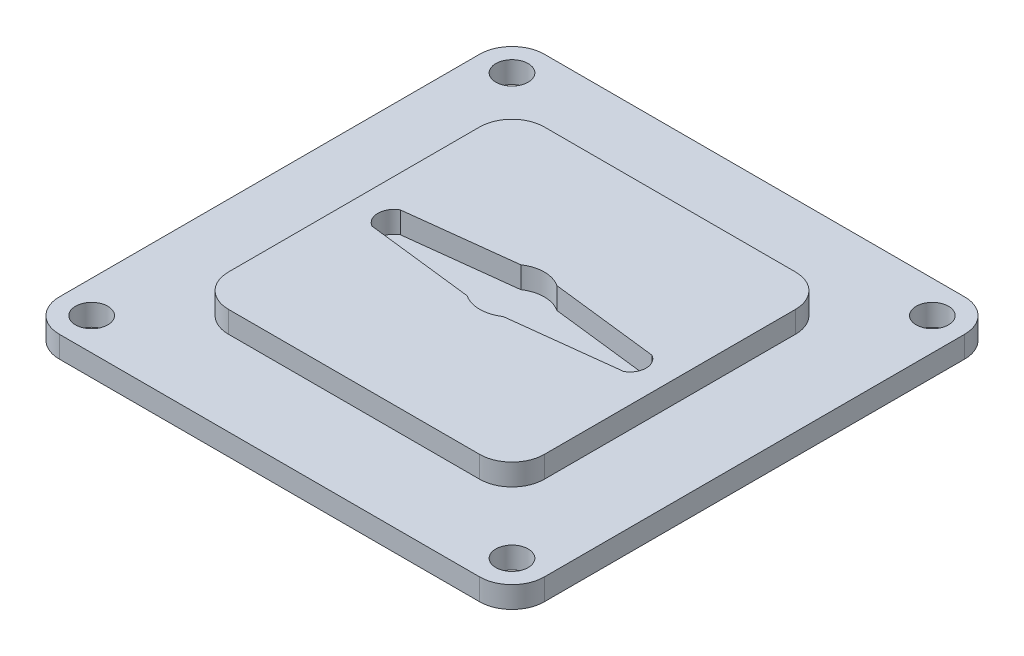
ISO-10303-21;
HEADER;
FILE_DESCRIPTION(('STEP AP214'),'2;1');
FILE_NAME('part.step','',(''),(''),'','','');
FILE_SCHEMA(('AUTOMOTIVE_DESIGN { 1 0 10303 214 1 1 1 1 }'));
ENDSEC;
DATA;
#1=APPLICATION_CONTEXT('core data for automotive mechanical design processes');
#2=APPLICATION_PROTOCOL_DEFINITION('international standard','automotive_design',2000,#1);
#3=PRODUCT_CONTEXT('',#1,'mechanical');
#4=PRODUCT('Part','Part','',(#3));
#5=PRODUCT_RELATED_PRODUCT_CATEGORY('part','',(#4));
#6=PRODUCT_DEFINITION_FORMATION('','',#4);
#7=PRODUCT_DEFINITION_CONTEXT('part definition',#1,'design');
#8=PRODUCT_DEFINITION('design','',#6,#7);
#9=PRODUCT_DEFINITION_SHAPE('','',#8);
#10=(LENGTH_UNIT() NAMED_UNIT(*) SI_UNIT(.MILLI.,.METRE.));
#11=(NAMED_UNIT(*) PLANE_ANGLE_UNIT() SI_UNIT($,.RADIAN.));
#12=(NAMED_UNIT(*) SI_UNIT($,.STERADIAN.) SOLID_ANGLE_UNIT());
#13=UNCERTAINTY_MEASURE_WITH_UNIT(LENGTH_MEASURE(1.E-05),#10,'distance_accuracy_value','');
#14=(GEOMETRIC_REPRESENTATION_CONTEXT(3) GLOBAL_UNCERTAINTY_ASSIGNED_CONTEXT((#13)) GLOBAL_UNIT_ASSIGNED_CONTEXT((#10,
#11,#12)) REPRESENTATION_CONTEXT('',''));
#15=CARTESIAN_POINT('',(0.,0.,0.));
#16=DIRECTION('',(0.,0.,1.));
#17=DIRECTION('',(1.,0.,0.));
#18=AXIS2_PLACEMENT_3D('',#15,#16,#17);
#19=CARTESIAN_POINT('',(-19.5,2.,19.5));
#20=DIRECTION('',(0.,1.,0.));
#21=DIRECTION('',(0.,0.,1.));
#22=AXIS2_PLACEMENT_3D('',#19,#20,#21);
#23=PLANE('',#22);
#24=CARTESIAN_POINT('',(-19.5,2.,-19.5));
#25=DIRECTION('',(0.,1.,0.));
#26=DIRECTION('',(0.,0.,1.));
#27=AXIS2_PLACEMENT_3D('',#24,#25,#26);
#28=CIRCLE('',#27,1.5);
#29=CARTESIAN_POINT('',(-19.5,2.,-18.));
#30=VERTEX_POINT('',#29);
#31=EDGE_CURVE('E331',#30,#30,#28,.T.);
#32=ORIENTED_EDGE('',*,*,#31,.F.);
#33=EDGE_LOOP('',(#32));
#34=FACE_BOUND('',#33,.T.);
#35=CARTESIAN_POINT('',(19.5,2.,19.5));
#36=DIRECTION('',(0.,1.,0.));
#37=DIRECTION('',(0.,0.,1.));
#38=AXIS2_PLACEMENT_3D('',#35,#36,#37);
#39=CIRCLE('',#38,1.5);
#40=CARTESIAN_POINT('',(19.5,2.,21.));
#41=VERTEX_POINT('',#40);
#42=EDGE_CURVE('E343',#41,#41,#39,.T.);
#43=ORIENTED_EDGE('',*,*,#42,.F.);
#44=EDGE_LOOP('',(#43));
#45=FACE_BOUND('',#44,.T.);
#46=CARTESIAN_POINT('',(-19.5,2.,19.5));
#47=DIRECTION('',(0.,1.,0.));
#48=DIRECTION('',(0.,0.,1.));
#49=AXIS2_PLACEMENT_3D('',#46,#47,#48);
#50=CIRCLE('',#49,3.);
#51=CARTESIAN_POINT('',(-22.5,2.,19.5));
#52=VERTEX_POINT('',#51);
#53=CARTESIAN_POINT('',(-19.5,2.,22.5));
#54=VERTEX_POINT('',#53);
#55=EDGE_CURVE('E349',#52,#54,#50,.T.);
#56=ORIENTED_EDGE('',*,*,#55,.T.);
#57=DIRECTION('',(1.,0.,0.));
#58=VECTOR('',#57,1.);
#59=CARTESIAN_POINT('',(-19.5,2.,22.5));
#60=LINE('',#59,#58);
#61=CARTESIAN_POINT('',(19.5,2.,22.5));
#62=VERTEX_POINT('',#61);
#63=EDGE_CURVE('E352',#54,#62,#60,.T.);
#64=ORIENTED_EDGE('',*,*,#63,.T.);
#65=CARTESIAN_POINT('',(19.5,2.,19.5));
#66=DIRECTION('',(0.,1.,0.));
#67=DIRECTION('',(0.,0.,1.));
#68=AXIS2_PLACEMENT_3D('',#65,#66,#67);
#69=CIRCLE('',#68,3.);
#70=CARTESIAN_POINT('',(22.5,2.,19.5));
#71=VERTEX_POINT('',#70);
#72=EDGE_CURVE('E355',#62,#71,#69,.T.);
#73=ORIENTED_EDGE('',*,*,#72,.T.);
#74=DIRECTION('',(0.,0.,-1.));
#75=VECTOR('',#74,1.);
#76=CARTESIAN_POINT('',(22.5,2.,-19.5));
#77=LINE('',#76,#75);
#78=CARTESIAN_POINT('',(22.5,2.,-19.5));
#79=VERTEX_POINT('',#78);
#80=EDGE_CURVE('E357',#71,#79,#77,.T.);
#81=ORIENTED_EDGE('',*,*,#80,.T.);
#82=CARTESIAN_POINT('',(19.5,2.,-19.5));
#83=DIRECTION('',(0.,1.,0.));
#84=DIRECTION('',(0.,0.,-1.));
#85=AXIS2_PLACEMENT_3D('',#82,#83,#84);
#86=CIRCLE('',#85,3.);
#87=CARTESIAN_POINT('',(19.5,2.,-22.5));
#88=VERTEX_POINT('',#87);
#89=EDGE_CURVE('E359',#79,#88,#86,.T.);
#90=ORIENTED_EDGE('',*,*,#89,.T.);
#91=DIRECTION('',(-1.,0.,0.));
#92=VECTOR('',#91,1.);
#93=CARTESIAN_POINT('',(-19.5,2.,-22.5));
#94=LINE('',#93,#92);
#95=CARTESIAN_POINT('',(-19.5,2.,-22.5));
#96=VERTEX_POINT('',#95);
#97=EDGE_CURVE('E361',#88,#96,#94,.T.);
#98=ORIENTED_EDGE('',*,*,#97,.T.);
#99=CARTESIAN_POINT('',(-19.5,2.,-19.5));
#100=DIRECTION('',(0.,1.,0.));
#101=DIRECTION('',(0.,0.,1.));
#102=AXIS2_PLACEMENT_3D('',#99,#100,#101);
#103=CIRCLE('',#102,3.);
#104=CARTESIAN_POINT('',(-22.5,2.,-19.5));
#105=VERTEX_POINT('',#104);
#106=EDGE_CURVE('E363',#96,#105,#103,.T.);
#107=ORIENTED_EDGE('',*,*,#106,.T.);
#108=DIRECTION('',(0.,0.,1.));
#109=VECTOR('',#108,1.);
#110=CARTESIAN_POINT('',(-22.5,2.,-19.5));
#111=LINE('',#110,#109);
#112=EDGE_CURVE('E365',#105,#52,#111,.T.);
#113=ORIENTED_EDGE('',*,*,#112,.T.);
#114=EDGE_LOOP('',(#56,#64,#73,#81,#90,#98,#107,#113));
#115=FACE_BOUND('',#114,.T.);
#116=CARTESIAN_POINT('',(19.5,2.,-19.5));
#117=DIRECTION('',(0.,1.,0.));
#118=DIRECTION('',(0.,0.,1.));
#119=AXIS2_PLACEMENT_3D('',#116,#117,#118);
#120=CIRCLE('',#119,1.5);
#121=CARTESIAN_POINT('',(19.5,2.,-18.));
#122=VERTEX_POINT('',#121);
#123=EDGE_CURVE('E337',#122,#122,#120,.T.);
#124=ORIENTED_EDGE('',*,*,#123,.F.);
#125=EDGE_LOOP('',(#124));
#126=FACE_BOUND('',#125,.T.);
#127=CARTESIAN_POINT('',(-19.5,2.,19.5));
#128=DIRECTION('',(0.,1.,0.));
#129=DIRECTION('',(0.,0.,1.));
#130=AXIS2_PLACEMENT_3D('',#127,#128,#129);
#131=CIRCLE('',#130,1.5);
#132=CARTESIAN_POINT('',(-19.5,2.,21.));
#133=VERTEX_POINT('',#132);
#134=EDGE_CURVE('E325',#133,#133,#131,.T.);
#135=ORIENTED_EDGE('',*,*,#134,.F.);
#136=EDGE_LOOP('',(#135));
#137=FACE_BOUND('',#136,.T.);
#138=DIRECTION('',(0.,0.,1.));
#139=VECTOR('',#138,1.);
#140=CARTESIAN_POINT('',(-14.653247837034,2.,-11.653247837034));
#141=LINE('',#140,#139);
#142=CARTESIAN_POINT('',(-14.653247837034,2.,-11.653247837034));
#143=VERTEX_POINT('',#142);
#144=CARTESIAN_POINT('',(-14.653247837034,2.,11.653247837034));
#145=VERTEX_POINT('',#144);
#146=EDGE_CURVE('E291',#143,#145,#141,.T.);
#147=ORIENTED_EDGE('',*,*,#146,.F.);
#148=CARTESIAN_POINT('',(-11.653247837034,2.,-11.653247837034));
#149=DIRECTION('',(0.,1.,0.));
#150=DIRECTION('',(0.,0.,1.));
#151=AXIS2_PLACEMENT_3D('',#148,#149,#150);
#152=CIRCLE('',#151,3.);
#153=CARTESIAN_POINT('',(-11.653247837034,2.,-14.653247837034));
#154=VERTEX_POINT('',#153);
#155=EDGE_CURVE('E258',#154,#143,#152,.T.);
#156=ORIENTED_EDGE('',*,*,#155,.F.);
#157=DIRECTION('',(-1.,0.,0.));
#158=VECTOR('',#157,1.);
#159=CARTESIAN_POINT('',(-11.653247837034,2.,-14.653247837034));
#160=LINE('',#159,#158);
#161=CARTESIAN_POINT('',(11.6532478370339,2.,-14.653247837034));
#162=VERTEX_POINT('',#161);
#163=EDGE_CURVE('E274',#162,#154,#160,.T.);
#164=ORIENTED_EDGE('',*,*,#163,.F.);
#165=CARTESIAN_POINT('',(11.653247837034,2.,-11.653247837034));
#166=DIRECTION('',(0.,1.,0.));
#167=DIRECTION('',(0.,0.,-1.));
#168=AXIS2_PLACEMENT_3D('',#165,#166,#167);
#169=CIRCLE('',#168,3.);
#170=CARTESIAN_POINT('',(14.653247837034,2.,-11.653247837034));
#171=VERTEX_POINT('',#170);
#172=EDGE_CURVE('E301',#171,#162,#169,.T.);
#173=ORIENTED_EDGE('',*,*,#172,.F.);
#174=DIRECTION('',(0.,0.,-1.));
#175=VECTOR('',#174,1.);
#176=CARTESIAN_POINT('',(14.653247837034,2.,-11.653247837034));
#177=LINE('',#176,#175);
#178=CARTESIAN_POINT('',(14.653247837034,2.,11.653247837034));
#179=VERTEX_POINT('',#178);
#180=EDGE_CURVE('E299',#179,#171,#177,.T.);
#181=ORIENTED_EDGE('',*,*,#180,.F.);
#182=CARTESIAN_POINT('',(11.653247837034,2.,11.653247837034));
#183=DIRECTION('',(0.,1.,0.));
#184=DIRECTION('',(0.,0.,1.));
#185=AXIS2_PLACEMENT_3D('',#182,#183,#184);
#186=CIRCLE('',#185,3.);
#187=CARTESIAN_POINT('',(11.653247837034,2.,14.653247837034));
#188=VERTEX_POINT('',#187);
#189=EDGE_CURVE('E297',#188,#179,#186,.T.);
#190=ORIENTED_EDGE('',*,*,#189,.F.);
#191=DIRECTION('',(1.,0.,0.));
#192=VECTOR('',#191,1.);
#193=CARTESIAN_POINT('',(-11.653247837034,2.,14.653247837034));
#194=LINE('',#193,#192);
#195=CARTESIAN_POINT('',(-11.653247837034,2.,14.653247837034));
#196=VERTEX_POINT('',#195);
#197=EDGE_CURVE('E295',#196,#188,#194,.T.);
#198=ORIENTED_EDGE('',*,*,#197,.F.);
#199=CARTESIAN_POINT('',(-11.653247837034,2.,11.653247837034));
#200=DIRECTION('',(0.,1.,0.));
#201=DIRECTION('',(0.,0.,1.));
#202=AXIS2_PLACEMENT_3D('',#199,#200,#201);
#203=CIRCLE('',#202,3.);
#204=EDGE_CURVE('E293',#145,#196,#203,.T.);
#205=ORIENTED_EDGE('',*,*,#204,.F.);
#206=EDGE_LOOP('',(#147,#156,#164,#173,#181,#190,#198,#205));
#207=FACE_BOUND('',#206,.T.);
#208=ADVANCED_FACE('F37',(#34,#45,#115,#126,#137,#207),#23,.T.);
#209=CARTESIAN_POINT('',(-19.5,0.,19.5));
#210=DIRECTION('',(0.,1.,0.));
#211=DIRECTION('',(0.,0.,1.));
#212=AXIS2_PLACEMENT_3D('',#209,#210,#211);
#213=PLANE('',#212);
#214=CARTESIAN_POINT('',(-19.5,0.,19.5));
#215=DIRECTION('',(0.,1.,0.));
#216=DIRECTION('',(0.,0.,1.));
#217=AXIS2_PLACEMENT_3D('',#214,#215,#216);
#218=CIRCLE('',#217,3.);
#219=CARTESIAN_POINT('',(-22.5,0.,19.5));
#220=VERTEX_POINT('',#219);
#221=CARTESIAN_POINT('',(-19.5,0.,22.5));
#222=VERTEX_POINT('',#221);
#223=EDGE_CURVE('E346',#220,#222,#218,.T.);
#224=ORIENTED_EDGE('',*,*,#223,.F.);
#225=DIRECTION('',(0.,0.,1.));
#226=VECTOR('',#225,1.);
#227=CARTESIAN_POINT('',(-22.5,0.,-19.5));
#228=LINE('',#227,#226);
#229=CARTESIAN_POINT('',(-22.5,0.,-19.5));
#230=VERTEX_POINT('',#229);
#231=EDGE_CURVE('E353',#230,#220,#228,.T.);
#232=ORIENTED_EDGE('',*,*,#231,.F.);
#233=CARTESIAN_POINT('',(-19.5,0.,-19.5));
#234=DIRECTION('',(0.,1.,0.));
#235=DIRECTION('',(0.,0.,1.));
#236=AXIS2_PLACEMENT_3D('',#233,#234,#235);
#237=CIRCLE('',#236,3.);
#238=CARTESIAN_POINT('',(-19.5,0.,-22.5));
#239=VERTEX_POINT('',#238);
#240=EDGE_CURVE('E380',#239,#230,#237,.T.);
#241=ORIENTED_EDGE('',*,*,#240,.F.);
#242=DIRECTION('',(-1.,0.,0.));
#243=VECTOR('',#242,1.);
#244=CARTESIAN_POINT('',(-19.5,0.,-22.5));
#245=LINE('',#244,#243);
#246=CARTESIAN_POINT('',(19.5,0.,-22.5));
#247=VERTEX_POINT('',#246);
#248=EDGE_CURVE('E378',#247,#239,#245,.T.);
#249=ORIENTED_EDGE('',*,*,#248,.F.);
#250=CARTESIAN_POINT('',(19.5,0.,-19.5));
#251=DIRECTION('',(0.,1.,0.));
#252=DIRECTION('',(0.,0.,-1.));
#253=AXIS2_PLACEMENT_3D('',#250,#251,#252);
#254=CIRCLE('',#253,3.);
#255=CARTESIAN_POINT('',(22.5,0.,-19.5));
#256=VERTEX_POINT('',#255);
#257=EDGE_CURVE('E376',#256,#247,#254,.T.);
#258=ORIENTED_EDGE('',*,*,#257,.F.);
#259=DIRECTION('',(0.,0.,-1.));
#260=VECTOR('',#259,1.);
#261=CARTESIAN_POINT('',(22.5,0.,-19.5));
#262=LINE('',#261,#260);
#263=CARTESIAN_POINT('',(22.5,0.,19.5));
#264=VERTEX_POINT('',#263);
#265=EDGE_CURVE('E374',#264,#256,#262,.T.);
#266=ORIENTED_EDGE('',*,*,#265,.F.);
#267=CARTESIAN_POINT('',(19.5,0.,19.5));
#268=DIRECTION('',(0.,1.,0.));
#269=DIRECTION('',(0.,0.,1.));
#270=AXIS2_PLACEMENT_3D('',#267,#268,#269);
#271=CIRCLE('',#270,3.);
#272=CARTESIAN_POINT('',(19.5,0.,22.5));
#273=VERTEX_POINT('',#272);
#274=EDGE_CURVE('E372',#273,#264,#271,.T.);
#275=ORIENTED_EDGE('',*,*,#274,.F.);
#276=DIRECTION('',(1.,0.,0.));
#277=VECTOR('',#276,1.);
#278=CARTESIAN_POINT('',(-19.5,0.,22.5));
#279=LINE('',#278,#277);
#280=EDGE_CURVE('E370',#222,#273,#279,.T.);
#281=ORIENTED_EDGE('',*,*,#280,.F.);
#282=EDGE_LOOP('',(#224,#232,#241,#249,#258,#266,#275,#281));
#283=FACE_BOUND('',#282,.T.);
#284=CARTESIAN_POINT('',(19.5,0.,19.5));
#285=DIRECTION('',(0.,1.,0.));
#286=DIRECTION('',(0.,0.,1.));
#287=AXIS2_PLACEMENT_3D('',#284,#285,#286);
#288=CIRCLE('',#287,1.5);
#289=CARTESIAN_POINT('',(19.5,0.,21.));
#290=VERTEX_POINT('',#289);
#291=EDGE_CURVE('E340',#290,#290,#288,.T.);
#292=ORIENTED_EDGE('',*,*,#291,.T.);
#293=EDGE_LOOP('',(#292));
#294=FACE_BOUND('',#293,.T.);
#295=CARTESIAN_POINT('',(19.5,0.,-19.5));
#296=DIRECTION('',(0.,1.,0.));
#297=DIRECTION('',(0.,0.,1.));
#298=AXIS2_PLACEMENT_3D('',#295,#296,#297);
#299=CIRCLE('',#298,1.5);
#300=CARTESIAN_POINT('',(19.5,0.,-18.));
#301=VERTEX_POINT('',#300);
#302=EDGE_CURVE('E334',#301,#301,#299,.T.);
#303=ORIENTED_EDGE('',*,*,#302,.T.);
#304=EDGE_LOOP('',(#303));
#305=FACE_BOUND('',#304,.T.);
#306=CARTESIAN_POINT('',(-19.5,0.,-19.5));
#307=DIRECTION('',(0.,1.,0.));
#308=DIRECTION('',(0.,0.,1.));
#309=AXIS2_PLACEMENT_3D('',#306,#307,#308);
#310=CIRCLE('',#309,1.5);
#311=CARTESIAN_POINT('',(-19.5,0.,-18.));
#312=VERTEX_POINT('',#311);
#313=EDGE_CURVE('E328',#312,#312,#310,.T.);
#314=ORIENTED_EDGE('',*,*,#313,.T.);
#315=EDGE_LOOP('',(#314));
#316=FACE_BOUND('',#315,.T.);
#317=CARTESIAN_POINT('',(-19.5,0.,19.5));
#318=DIRECTION('',(0.,1.,0.));
#319=DIRECTION('',(0.,0.,1.));
#320=AXIS2_PLACEMENT_3D('',#317,#318,#319);
#321=CIRCLE('',#320,1.5);
#322=CARTESIAN_POINT('',(-19.5,0.,21.));
#323=VERTEX_POINT('',#322);
#324=EDGE_CURVE('E324',#323,#323,#321,.T.);
#325=ORIENTED_EDGE('',*,*,#324,.T.);
#326=EDGE_LOOP('',(#325));
#327=FACE_BOUND('',#326,.T.);
#328=ADVANCED_FACE('F410',(#283,#294,#305,#316,#327),#213,.F.);
#329=CARTESIAN_POINT('',(-19.5,2.,19.5));
#330=DIRECTION('',(0.,-1.,0.));
#331=DIRECTION('',(0.,0.,-1.));
#332=AXIS2_PLACEMENT_3D('',#329,#330,#331);
#333=CYLINDRICAL_SURFACE('',#332,3.);
#334=ORIENTED_EDGE('',*,*,#223,.T.);
#335=DIRECTION('',(0.,-1.,0.));
#336=VECTOR('',#335,1.);
#337=CARTESIAN_POINT('',(-19.5,2.,22.5));
#338=LINE('',#337,#336);
#339=EDGE_CURVE('E11',#54,#222,#338,.T.);
#340=ORIENTED_EDGE('',*,*,#339,.F.);
#341=ORIENTED_EDGE('',*,*,#55,.F.);
#342=DIRECTION('',(0.,-1.,0.));
#343=VECTOR('',#342,1.);
#344=CARTESIAN_POINT('',(-22.5,2.,19.5));
#345=LINE('',#344,#343);
#346=EDGE_CURVE('E367',#52,#220,#345,.T.);
#347=ORIENTED_EDGE('',*,*,#346,.T.);
#348=EDGE_LOOP('',(#334,#340,#341,#347));
#349=FACE_BOUND('',#348,.T.);
#350=ADVANCED_FACE('F39',(#349),#333,.T.);
#351=CARTESIAN_POINT('',(-19.5,2.,22.5));
#352=DIRECTION('',(0.,0.,-1.));
#353=DIRECTION('',(-1.,0.,0.));
#354=AXIS2_PLACEMENT_3D('',#351,#352,#353);
#355=PLANE('',#354);
#356=ORIENTED_EDGE('',*,*,#280,.T.);
#357=DIRECTION('',(0.,-1.,0.));
#358=VECTOR('',#357,1.);
#359=CARTESIAN_POINT('',(19.5,2.,22.5));
#360=LINE('',#359,#358);
#361=EDGE_CURVE('E45',#62,#273,#360,.T.);
#362=ORIENTED_EDGE('',*,*,#361,.F.);
#363=ORIENTED_EDGE('',*,*,#63,.F.);
#364=ORIENTED_EDGE('',*,*,#339,.T.);
#365=EDGE_LOOP('',(#356,#362,#363,#364));
#366=FACE_BOUND('',#365,.T.);
#367=ADVANCED_FACE('F428',(#366),#355,.F.);
#368=CARTESIAN_POINT('',(19.5,2.,19.5));
#369=DIRECTION('',(0.,-1.,0.));
#370=DIRECTION('',(0.,0.,-1.));
#371=AXIS2_PLACEMENT_3D('',#368,#369,#370);
#372=CYLINDRICAL_SURFACE('',#371,3.);
#373=ORIENTED_EDGE('',*,*,#274,.T.);
#374=DIRECTION('',(0.,-1.,0.));
#375=VECTOR('',#374,1.);
#376=CARTESIAN_POINT('',(22.5,2.,19.5));
#377=LINE('',#376,#375);
#378=EDGE_CURVE('E397',#71,#264,#377,.T.);
#379=ORIENTED_EDGE('',*,*,#378,.F.);
#380=ORIENTED_EDGE('',*,*,#72,.F.);
#381=ORIENTED_EDGE('',*,*,#361,.T.);
#382=EDGE_LOOP('',(#373,#379,#380,#381));
#383=FACE_BOUND('',#382,.T.);
#384=ADVANCED_FACE('F404',(#383),#372,.T.);
#385=CARTESIAN_POINT('',(22.5,2.,-19.5));
#386=DIRECTION('',(-1.,0.,0.));
#387=DIRECTION('',(0.,0.,1.));
#388=AXIS2_PLACEMENT_3D('',#385,#386,#387);
#389=PLANE('',#388);
#390=ORIENTED_EDGE('',*,*,#265,.T.);
#391=DIRECTION('',(0.,-1.,0.));
#392=VECTOR('',#391,1.);
#393=CARTESIAN_POINT('',(22.5,2.,-19.5));
#394=LINE('',#393,#392);
#395=EDGE_CURVE('E394',#79,#256,#394,.T.);
#396=ORIENTED_EDGE('',*,*,#395,.F.);
#397=ORIENTED_EDGE('',*,*,#80,.F.);
#398=ORIENTED_EDGE('',*,*,#378,.T.);
#399=EDGE_LOOP('',(#390,#396,#397,#398));
#400=FACE_BOUND('',#399,.T.);
#401=ADVANCED_FACE('F416',(#400),#389,.F.);
#402=CARTESIAN_POINT('',(19.5,2.,-19.5));
#403=DIRECTION('',(0.,-1.,0.));
#404=DIRECTION('',(0.,0.,-1.));
#405=AXIS2_PLACEMENT_3D('',#402,#403,#404);
#406=CYLINDRICAL_SURFACE('',#405,3.);
#407=ORIENTED_EDGE('',*,*,#257,.T.);
#408=DIRECTION('',(0.,-1.,0.));
#409=VECTOR('',#408,1.);
#410=CARTESIAN_POINT('',(19.5,2.,-22.5));
#411=LINE('',#410,#409);
#412=EDGE_CURVE('E391',#88,#247,#411,.T.);
#413=ORIENTED_EDGE('',*,*,#412,.F.);
#414=ORIENTED_EDGE('',*,*,#89,.F.);
#415=ORIENTED_EDGE('',*,*,#395,.T.);
#416=EDGE_LOOP('',(#407,#413,#414,#415));
#417=FACE_BOUND('',#416,.T.);
#418=ADVANCED_FACE('F420',(#417),#406,.T.);
#419=CARTESIAN_POINT('',(-19.5,2.,-22.5));
#420=DIRECTION('',(0.,0.,1.));
#421=DIRECTION('',(1.,0.,0.));
#422=AXIS2_PLACEMENT_3D('',#419,#420,#421);
#423=PLANE('',#422);
#424=ORIENTED_EDGE('',*,*,#248,.T.);
#425=DIRECTION('',(0.,-1.,0.));
#426=VECTOR('',#425,1.);
#427=CARTESIAN_POINT('',(-19.5,2.,-22.5));
#428=LINE('',#427,#426);
#429=EDGE_CURVE('E388',#96,#239,#428,.T.);
#430=ORIENTED_EDGE('',*,*,#429,.F.);
#431=ORIENTED_EDGE('',*,*,#97,.F.);
#432=ORIENTED_EDGE('',*,*,#412,.T.);
#433=EDGE_LOOP('',(#424,#430,#431,#432));
#434=FACE_BOUND('',#433,.T.);
#435=ADVANCED_FACE('F441',(#434),#423,.F.);
#436=CARTESIAN_POINT('',(-19.5,2.,-19.5));
#437=DIRECTION('',(0.,-1.,0.));
#438=DIRECTION('',(0.,0.,-1.));
#439=AXIS2_PLACEMENT_3D('',#436,#437,#438);
#440=CYLINDRICAL_SURFACE('',#439,3.);
#441=ORIENTED_EDGE('',*,*,#240,.T.);
#442=DIRECTION('',(0.,-1.,0.));
#443=VECTOR('',#442,1.);
#444=CARTESIAN_POINT('',(-22.5,2.,-19.5));
#445=LINE('',#444,#443);
#446=EDGE_CURVE('E385',#105,#230,#445,.T.);
#447=ORIENTED_EDGE('',*,*,#446,.F.);
#448=ORIENTED_EDGE('',*,*,#106,.F.);
#449=ORIENTED_EDGE('',*,*,#429,.T.);
#450=EDGE_LOOP('',(#441,#447,#448,#449));
#451=FACE_BOUND('',#450,.T.);
#452=ADVANCED_FACE('F439',(#451),#440,.T.);
#453=CARTESIAN_POINT('',(-22.5,2.,-19.5));
#454=DIRECTION('',(1.,0.,0.));
#455=DIRECTION('',(0.,0.,-1.));
#456=AXIS2_PLACEMENT_3D('',#453,#454,#455);
#457=PLANE('',#456);
#458=ORIENTED_EDGE('',*,*,#231,.T.);
#459=ORIENTED_EDGE('',*,*,#346,.F.);
#460=ORIENTED_EDGE('',*,*,#112,.F.);
#461=ORIENTED_EDGE('',*,*,#446,.T.);
#462=EDGE_LOOP('',(#458,#459,#460,#461));
#463=FACE_BOUND('',#462,.T.);
#464=ADVANCED_FACE('F434',(#463),#457,.F.);
#465=CARTESIAN_POINT('',(19.5,2.,19.5));
#466=DIRECTION('',(0.,-1.,0.));
#467=DIRECTION('',(0.,0.,-1.));
#468=AXIS2_PLACEMENT_3D('',#465,#466,#467);
#469=CYLINDRICAL_SURFACE('',#468,1.5);
#470=ORIENTED_EDGE('',*,*,#42,.T.);
#471=EDGE_LOOP('',(#470));
#472=FACE_BOUND('',#471,.T.);
#473=ORIENTED_EDGE('',*,*,#291,.F.);
#474=EDGE_LOOP('',(#473));
#475=FACE_BOUND('',#474,.T.);
#476=ADVANCED_FACE('F460',(#472,#475),#469,.F.);
#477=CARTESIAN_POINT('',(19.5,2.,-19.5));
#478=DIRECTION('',(0.,-1.,0.));
#479=DIRECTION('',(0.,0.,-1.));
#480=AXIS2_PLACEMENT_3D('',#477,#478,#479);
#481=CYLINDRICAL_SURFACE('',#480,1.5);
#482=ORIENTED_EDGE('',*,*,#123,.T.);
#483=EDGE_LOOP('',(#482));
#484=FACE_BOUND('',#483,.T.);
#485=ORIENTED_EDGE('',*,*,#302,.F.);
#486=EDGE_LOOP('',(#485));
#487=FACE_BOUND('',#486,.T.);
#488=ADVANCED_FACE('F467',(#484,#487),#481,.F.);
#489=CARTESIAN_POINT('',(-19.5,2.,-19.5));
#490=DIRECTION('',(0.,-1.,0.));
#491=DIRECTION('',(0.,0.,-1.));
#492=AXIS2_PLACEMENT_3D('',#489,#490,#491);
#493=CYLINDRICAL_SURFACE('',#492,1.5);
#494=ORIENTED_EDGE('',*,*,#31,.T.);
#495=EDGE_LOOP('',(#494));
#496=FACE_BOUND('',#495,.T.);
#497=ORIENTED_EDGE('',*,*,#313,.F.);
#498=EDGE_LOOP('',(#497));
#499=FACE_BOUND('',#498,.T.);
#500=ADVANCED_FACE('F472',(#496,#499),#493,.F.);
#501=CARTESIAN_POINT('',(-19.5,2.,19.5));
#502=DIRECTION('',(0.,-1.,0.));
#503=DIRECTION('',(0.,0.,-1.));
#504=AXIS2_PLACEMENT_3D('',#501,#502,#503);
#505=CYLINDRICAL_SURFACE('',#504,1.5);
#506=ORIENTED_EDGE('',*,*,#134,.T.);
#507=EDGE_LOOP('',(#506));
#508=FACE_BOUND('',#507,.T.);
#509=ORIENTED_EDGE('',*,*,#324,.F.);
#510=EDGE_LOOP('',(#509));
#511=FACE_BOUND('',#510,.T.);
#512=ADVANCED_FACE('F484',(#508,#511),#505,.F.);
#513=CARTESIAN_POINT('',(-11.653247837034,4.,-11.653247837034));
#514=DIRECTION('',(0.,-1.,0.));
#515=DIRECTION('',(0.,0.,-1.));
#516=AXIS2_PLACEMENT_3D('',#513,#514,#515);
#517=CYLINDRICAL_SURFACE('',#516,3.);
#518=ORIENTED_EDGE('',*,*,#155,.T.);
#519=DIRECTION('',(0.,-1.,0.));
#520=VECTOR('',#519,1.);
#521=CARTESIAN_POINT('',(-14.653247837034,4.,-11.653247837034));
#522=LINE('',#521,#520);
#523=CARTESIAN_POINT('',(-14.653247837034,4.,-11.653247837034));
#524=VERTEX_POINT('',#523);
#525=EDGE_CURVE('E322',#524,#143,#522,.T.);
#526=ORIENTED_EDGE('',*,*,#525,.F.);
#527=CARTESIAN_POINT('',(-11.653247837034,4.,-11.653247837034));
#528=DIRECTION('',(0.,1.,0.));
#529=DIRECTION('',(0.,0.,1.));
#530=AXIS2_PLACEMENT_3D('',#527,#528,#529);
#531=CIRCLE('',#530,3.);
#532=CARTESIAN_POINT('',(-11.653247837034,4.,-14.653247837034));
#533=VERTEX_POINT('',#532);
#534=EDGE_CURVE('E270',#533,#524,#531,.T.);
#535=ORIENTED_EDGE('',*,*,#534,.F.);
#536=DIRECTION('',(0.,-1.,0.));
#537=VECTOR('',#536,1.);
#538=CARTESIAN_POINT('',(-11.653247837034,4.,-14.653247837034));
#539=LINE('',#538,#537);
#540=EDGE_CURVE('E288',#533,#154,#539,.T.);
#541=ORIENTED_EDGE('',*,*,#540,.T.);
#542=EDGE_LOOP('',(#518,#526,#535,#541));
#543=FACE_BOUND('',#542,.T.);
#544=ADVANCED_FACE('F486',(#543),#517,.T.);
#545=CARTESIAN_POINT('',(-14.653247837034,4.,-11.653247837034));
#546=DIRECTION('',(1.,0.,0.));
#547=DIRECTION('',(0.,0.,-1.));
#548=AXIS2_PLACEMENT_3D('',#545,#546,#547);
#549=PLANE('',#548);
#550=ORIENTED_EDGE('',*,*,#146,.T.);
#551=DIRECTION('',(0.,-1.,0.));
#552=VECTOR('',#551,1.);
#553=CARTESIAN_POINT('',(-14.653247837034,4.,11.653247837034));
#554=LINE('',#553,#552);
#555=CARTESIAN_POINT('',(-14.653247837034,4.,11.653247837034));
#556=VERTEX_POINT('',#555);
#557=EDGE_CURVE('E319',#556,#145,#554,.T.);
#558=ORIENTED_EDGE('',*,*,#557,.F.);
#559=DIRECTION('',(0.,0.,1.));
#560=VECTOR('',#559,1.);
#561=CARTESIAN_POINT('',(-14.653247837034,4.,-11.653247837034));
#562=LINE('',#561,#560);
#563=EDGE_CURVE('E273',#524,#556,#562,.T.);
#564=ORIENTED_EDGE('',*,*,#563,.F.);
#565=ORIENTED_EDGE('',*,*,#525,.T.);
#566=EDGE_LOOP('',(#550,#558,#564,#565));
#567=FACE_BOUND('',#566,.T.);
#568=ADVANCED_FACE('F493',(#567),#549,.F.);
#569=CARTESIAN_POINT('',(-11.653247837034,4.,11.653247837034));
#570=DIRECTION('',(0.,-1.,0.));
#571=DIRECTION('',(0.,0.,-1.));
#572=AXIS2_PLACEMENT_3D('',#569,#570,#571);
#573=CYLINDRICAL_SURFACE('',#572,3.);
#574=ORIENTED_EDGE('',*,*,#204,.T.);
#575=DIRECTION('',(0.,-1.,0.));
#576=VECTOR('',#575,1.);
#577=CARTESIAN_POINT('',(-11.653247837034,4.,14.653247837034));
#578=LINE('',#577,#576);
#579=CARTESIAN_POINT('',(-11.653247837034,4.,14.653247837034));
#580=VERTEX_POINT('',#579);
#581=EDGE_CURVE('E316',#580,#196,#578,.T.);
#582=ORIENTED_EDGE('',*,*,#581,.F.);
#583=CARTESIAN_POINT('',(-11.653247837034,4.,11.653247837034));
#584=DIRECTION('',(0.,1.,0.));
#585=DIRECTION('',(0.,0.,1.));
#586=AXIS2_PLACEMENT_3D('',#583,#584,#585);
#587=CIRCLE('',#586,3.);
#588=EDGE_CURVE('E276',#556,#580,#587,.T.);
#589=ORIENTED_EDGE('',*,*,#588,.F.);
#590=ORIENTED_EDGE('',*,*,#557,.T.);
#591=EDGE_LOOP('',(#574,#582,#589,#590));
#592=FACE_BOUND('',#591,.T.);
#593=ADVANCED_FACE('F501',(#592),#573,.T.);
#594=CARTESIAN_POINT('',(-11.653247837034,4.,14.653247837034));
#595=DIRECTION('',(0.,0.,-1.));
#596=DIRECTION('',(-1.,0.,0.));
#597=AXIS2_PLACEMENT_3D('',#594,#595,#596);
#598=PLANE('',#597);
#599=ORIENTED_EDGE('',*,*,#197,.T.);
#600=DIRECTION('',(0.,-1.,0.));
#601=VECTOR('',#600,1.);
#602=CARTESIAN_POINT('',(11.653247837034,4.,14.653247837034));
#603=LINE('',#602,#601);
#604=CARTESIAN_POINT('',(11.653247837034,4.,14.653247837034));
#605=VERTEX_POINT('',#604);
#606=EDGE_CURVE('E313',#605,#188,#603,.T.);
#607=ORIENTED_EDGE('',*,*,#606,.F.);
#608=DIRECTION('',(1.,0.,0.));
#609=VECTOR('',#608,1.);
#610=CARTESIAN_POINT('',(-11.653247837034,4.,14.653247837034));
#611=LINE('',#610,#609);
#612=EDGE_CURVE('E278',#580,#605,#611,.T.);
#613=ORIENTED_EDGE('',*,*,#612,.F.);
#614=ORIENTED_EDGE('',*,*,#581,.T.);
#615=EDGE_LOOP('',(#599,#607,#613,#614));
#616=FACE_BOUND('',#615,.T.);
#617=ADVANCED_FACE('F505',(#616),#598,.F.);
#618=CARTESIAN_POINT('',(11.653247837034,4.,11.653247837034));
#619=DIRECTION('',(0.,-1.,0.));
#620=DIRECTION('',(0.,0.,-1.));
#621=AXIS2_PLACEMENT_3D('',#618,#619,#620);
#622=CYLINDRICAL_SURFACE('',#621,3.);
#623=ORIENTED_EDGE('',*,*,#189,.T.);
#624=DIRECTION('',(0.,-1.,0.));
#625=VECTOR('',#624,1.);
#626=CARTESIAN_POINT('',(14.653247837034,4.,11.653247837034));
#627=LINE('',#626,#625);
#628=CARTESIAN_POINT('',(14.653247837034,4.,11.653247837034));
#629=VERTEX_POINT('',#628);
#630=EDGE_CURVE('E310',#629,#179,#627,.T.);
#631=ORIENTED_EDGE('',*,*,#630,.F.);
#632=CARTESIAN_POINT('',(11.653247837034,4.,11.653247837034));
#633=DIRECTION('',(0.,1.,0.));
#634=DIRECTION('',(0.,0.,1.));
#635=AXIS2_PLACEMENT_3D('',#632,#633,#634);
#636=CIRCLE('',#635,3.);
#637=EDGE_CURVE('E280',#605,#629,#636,.T.);
#638=ORIENTED_EDGE('',*,*,#637,.F.);
#639=ORIENTED_EDGE('',*,*,#606,.T.);
#640=EDGE_LOOP('',(#623,#631,#638,#639));
#641=FACE_BOUND('',#640,.T.);
#642=ADVANCED_FACE('F509',(#641),#622,.T.);
#643=CARTESIAN_POINT('',(14.653247837034,4.,-11.653247837034));
#644=DIRECTION('',(-1.,0.,0.));
#645=DIRECTION('',(0.,0.,1.));
#646=AXIS2_PLACEMENT_3D('',#643,#644,#645);
#647=PLANE('',#646);
#648=ORIENTED_EDGE('',*,*,#180,.T.);
#649=DIRECTION('',(0.,-1.,0.));
#650=VECTOR('',#649,1.);
#651=CARTESIAN_POINT('',(14.653247837034,4.,-11.653247837034));
#652=LINE('',#651,#650);
#653=CARTESIAN_POINT('',(14.653247837034,4.,-11.653247837034));
#654=VERTEX_POINT('',#653);
#655=EDGE_CURVE('E307',#654,#171,#652,.T.);
#656=ORIENTED_EDGE('',*,*,#655,.F.);
#657=DIRECTION('',(0.,0.,-1.));
#658=VECTOR('',#657,1.);
#659=CARTESIAN_POINT('',(14.653247837034,4.,-11.653247837034));
#660=LINE('',#659,#658);
#661=EDGE_CURVE('E282',#629,#654,#660,.T.);
#662=ORIENTED_EDGE('',*,*,#661,.F.);
#663=ORIENTED_EDGE('',*,*,#630,.T.);
#664=EDGE_LOOP('',(#648,#656,#662,#663));
#665=FACE_BOUND('',#664,.T.);
#666=ADVANCED_FACE('F513',(#665),#647,.F.);
#667=CARTESIAN_POINT('',(11.653247837034,4.,-11.653247837034));
#668=DIRECTION('',(0.,-1.,0.));
#669=DIRECTION('',(0.,0.,-1.));
#670=AXIS2_PLACEMENT_3D('',#667,#668,#669);
#671=CYLINDRICAL_SURFACE('',#670,3.);
#672=ORIENTED_EDGE('',*,*,#172,.T.);
#673=DIRECTION('',(0.,-1.,0.));
#674=VECTOR('',#673,1.);
#675=CARTESIAN_POINT('',(11.653247837034,4.,-14.653247837034));
#676=LINE('',#675,#674);
#677=CARTESIAN_POINT('',(11.653247837034,4.,-14.653247837034));
#678=VERTEX_POINT('',#677);
#679=EDGE_CURVE('E60',#678,#162,#676,.T.);
#680=ORIENTED_EDGE('',*,*,#679,.F.);
#681=CARTESIAN_POINT('',(11.653247837034,4.,-11.653247837034));
#682=DIRECTION('',(0.,1.,0.));
#683=DIRECTION('',(0.,0.,-1.));
#684=AXIS2_PLACEMENT_3D('',#681,#682,#683);
#685=CIRCLE('',#684,3.);
#686=EDGE_CURVE('E284',#654,#678,#685,.T.);
#687=ORIENTED_EDGE('',*,*,#686,.F.);
#688=ORIENTED_EDGE('',*,*,#655,.T.);
#689=EDGE_LOOP('',(#672,#680,#687,#688));
#690=FACE_BOUND('',#689,.T.);
#691=ADVANCED_FACE('F517',(#690),#671,.T.);
#692=CARTESIAN_POINT('',(-11.653247837034,4.,-14.653247837034));
#693=DIRECTION('',(0.,0.,1.));
#694=DIRECTION('',(1.,0.,0.));
#695=AXIS2_PLACEMENT_3D('',#692,#693,#694);
#696=PLANE('',#695);
#697=ORIENTED_EDGE('',*,*,#163,.T.);
#698=ORIENTED_EDGE('',*,*,#540,.F.);
#699=DIRECTION('',(-1.,0.,0.));
#700=VECTOR('',#699,1.);
#701=CARTESIAN_POINT('',(-11.653247837034,4.,-14.653247837034));
#702=LINE('',#701,#700);
#703=EDGE_CURVE('E286',#678,#533,#702,.T.);
#704=ORIENTED_EDGE('',*,*,#703,.F.);
#705=ORIENTED_EDGE('',*,*,#679,.T.);
#706=EDGE_LOOP('',(#697,#698,#704,#705));
#707=FACE_BOUND('',#706,.T.);
#708=ADVANCED_FACE('F521',(#707),#696,.F.);
#709=CARTESIAN_POINT('',(-11.653247837034,4.,-11.653247837034));
#710=DIRECTION('',(0.,1.,0.));
#711=DIRECTION('',(0.,0.,1.));
#712=AXIS2_PLACEMENT_3D('',#709,#710,#711);
#713=PLANE('',#712);
#714=CARTESIAN_POINT('',(10.9442872380171,4.,0.));
#715=DIRECTION('',(0.,1.,0.));
#716=DIRECTION('',(0.,0.,-1.));
#717=AXIS2_PLACEMENT_3D('',#714,#715,#716);
#718=CIRCLE('',#717,1.5);
#719=CARTESIAN_POINT('',(11.6752461509772,4.,1.30984696341374));
#720=VERTEX_POINT('',#719);
#721=CARTESIAN_POINT('',(11.6752461509772,4.,-1.30984696341374));
#722=VERTEX_POINT('',#721);
#723=EDGE_CURVE('E52',#720,#722,#718,.T.);
#724=ORIENTED_EDGE('',*,*,#723,.F.);
#725=DIRECTION('',(0.993123300321031,0.,-0.117073098359371));
#726=VECTOR('',#725,1.);
#727=CARTESIAN_POINT('',(11.6752461509772,4.,1.30984696341374));
#728=LINE('',#727,#726);
#729=CARTESIAN_POINT('',(1.67524615097725,4.,2.48868445843099));
#730=VERTEX_POINT('',#729);
#731=EDGE_CURVE('E220',#730,#720,#728,.T.);
#732=ORIENTED_EDGE('',*,*,#731,.F.);
#733=CARTESIAN_POINT('',(0.,4.,0.));
#734=DIRECTION('',(0.,1.,0.));
#735=DIRECTION('',(0.,0.,1.));
#736=AXIS2_PLACEMENT_3D('',#733,#734,#735);
#737=CIRCLE('',#736,3.);
#738=CARTESIAN_POINT('',(-1.67524615097724,4.,2.48868445843099));
#739=VERTEX_POINT('',#738);
#740=EDGE_CURVE('E223',#739,#730,#737,.T.);
#741=ORIENTED_EDGE('',*,*,#740,.F.);
#742=DIRECTION('',(0.993123300321031,0.,0.117073098359371));
#743=VECTOR('',#742,1.);
#744=CARTESIAN_POINT('',(-11.6752461509772,4.,1.30984696341374));
#745=LINE('',#744,#743);
#746=CARTESIAN_POINT('',(-11.6752461509772,4.,1.30984696341374));
#747=VERTEX_POINT('',#746);
#748=EDGE_CURVE('E251',#747,#739,#745,.T.);
#749=ORIENTED_EDGE('',*,*,#748,.F.);
#750=CARTESIAN_POINT('',(-10.9442872380171,4.,0.));
#751=DIRECTION('',(0.,1.,0.));
#752=DIRECTION('',(0.,0.,1.));
#753=AXIS2_PLACEMENT_3D('',#750,#751,#752);
#754=CIRCLE('',#753,1.5);
#755=CARTESIAN_POINT('',(-11.6752461509772,4.,-1.30984696341374));
#756=VERTEX_POINT('',#755);
#757=EDGE_CURVE('E248',#756,#747,#754,.T.);
#758=ORIENTED_EDGE('',*,*,#757,.F.);
#759=DIRECTION('',(-0.993123300321031,0.,0.117073098359371));
#760=VECTOR('',#759,1.);
#761=CARTESIAN_POINT('',(-11.6752461509772,4.,-1.30984696341374));
#762=LINE('',#761,#760);
#763=CARTESIAN_POINT('',(-1.67524615097724,4.,-2.48868445843099));
#764=VERTEX_POINT('',#763);
#765=EDGE_CURVE('E245',#764,#756,#762,.T.);
#766=ORIENTED_EDGE('',*,*,#765,.F.);
#767=CARTESIAN_POINT('',(0.,4.,0.));
#768=DIRECTION('',(0.,1.,0.));
#769=DIRECTION('',(0.,0.,-1.));
#770=AXIS2_PLACEMENT_3D('',#767,#768,#769);
#771=CIRCLE('',#770,3.);
#772=CARTESIAN_POINT('',(1.67524615097724,4.,-2.48868445843099));
#773=VERTEX_POINT('',#772);
#774=EDGE_CURVE('E242',#773,#764,#771,.T.);
#775=ORIENTED_EDGE('',*,*,#774,.F.);
#776=DIRECTION('',(-0.993123300321031,0.,-0.11707309835937));
#777=VECTOR('',#776,1.);
#778=CARTESIAN_POINT('',(11.6752461509772,4.,-1.30984696341374));
#779=LINE('',#778,#777);
#780=EDGE_CURVE('E240',#722,#773,#779,.T.);
#781=ORIENTED_EDGE('',*,*,#780,.F.);
#782=EDGE_LOOP('',(#724,#732,#741,#749,#758,#766,#775,#781));
#783=FACE_BOUND('',#782,.T.);
#784=ORIENTED_EDGE('',*,*,#534,.T.);
#785=ORIENTED_EDGE('',*,*,#563,.T.);
#786=ORIENTED_EDGE('',*,*,#588,.T.);
#787=ORIENTED_EDGE('',*,*,#612,.T.);
#788=ORIENTED_EDGE('',*,*,#637,.T.);
#789=ORIENTED_EDGE('',*,*,#661,.T.);
#790=ORIENTED_EDGE('',*,*,#686,.T.);
#791=ORIENTED_EDGE('',*,*,#703,.T.);
#792=EDGE_LOOP('',(#784,#785,#786,#787,#788,#789,#790,#791));
#793=FACE_BOUND('',#792,.T.);
#794=ADVANCED_FACE('F525',(#783,#793),#713,.T.);
#795=CARTESIAN_POINT('',(10.9442872380171,2.,0.));
#796=DIRECTION('',(0.,1.,0.));
#797=DIRECTION('',(0.,0.,1.));
#798=AXIS2_PLACEMENT_3D('',#795,#796,#797);
#799=CYLINDRICAL_SURFACE('',#798,1.5);
#800=ORIENTED_EDGE('',*,*,#723,.T.);
#801=DIRECTION('',(0.,1.,0.));
#802=VECTOR('',#801,1.);
#803=CARTESIAN_POINT('',(11.6752461509772,2.,-1.30984696341374));
#804=LINE('',#803,#802);
#805=CARTESIAN_POINT('',(11.6752461509772,2.,-1.30984696341374));
#806=VERTEX_POINT('',#805);
#807=EDGE_CURVE('E197',#806,#722,#804,.T.);
#808=ORIENTED_EDGE('',*,*,#807,.F.);
#809=CARTESIAN_POINT('',(10.9442872380171,2.,0.));
#810=DIRECTION('',(0.,1.,0.));
#811=DIRECTION('',(0.,0.,-1.));
#812=AXIS2_PLACEMENT_3D('',#809,#810,#811);
#813=CIRCLE('',#812,1.5);
#814=CARTESIAN_POINT('',(11.6752461509772,2.,1.30984696341374));
#815=VERTEX_POINT('',#814);
#816=EDGE_CURVE('E201',#815,#806,#813,.T.);
#817=ORIENTED_EDGE('',*,*,#816,.F.);
#818=DIRECTION('',(0.,1.,0.));
#819=VECTOR('',#818,1.);
#820=CARTESIAN_POINT('',(11.6752461509772,2.,1.30984696341374));
#821=LINE('',#820,#819);
#822=EDGE_CURVE('E256',#815,#720,#821,.T.);
#823=ORIENTED_EDGE('',*,*,#822,.T.);
#824=EDGE_LOOP('',(#800,#808,#817,#823));
#825=FACE_BOUND('',#824,.T.);
#826=ADVANCED_FACE('F199',(#825),#799,.F.);
#827=CARTESIAN_POINT('',(11.6752461509772,2.,1.30984696341374));
#828=DIRECTION('',(0.117073098359371,0.,0.993123300321031));
#829=DIRECTION('',(0.993123300321031,0.,-0.117073098359371));
#830=AXIS2_PLACEMENT_3D('',#827,#828,#829);
#831=PLANE('',#830);
#832=ORIENTED_EDGE('',*,*,#731,.T.);
#833=ORIENTED_EDGE('',*,*,#822,.F.);
#834=DIRECTION('',(0.993123300321031,0.,-0.117073098359371));
#835=VECTOR('',#834,1.);
#836=CARTESIAN_POINT('',(11.6752461509772,2.,1.30984696341374));
#837=LINE('',#836,#835);
#838=CARTESIAN_POINT('',(1.67524615097725,2.,2.48868445843099));
#839=VERTEX_POINT('',#838);
#840=EDGE_CURVE('E207',#839,#815,#837,.T.);
#841=ORIENTED_EDGE('',*,*,#840,.F.);
#842=DIRECTION('',(0.,1.,0.));
#843=VECTOR('',#842,1.);
#844=CARTESIAN_POINT('',(1.67524615097725,2.,2.48868445843099));
#845=LINE('',#844,#843);
#846=EDGE_CURVE('E259',#839,#730,#845,.T.);
#847=ORIENTED_EDGE('',*,*,#846,.T.);
#848=EDGE_LOOP('',(#832,#833,#841,#847));
#849=FACE_BOUND('',#848,.T.);
#850=ADVANCED_FACE('F531',(#849),#831,.F.);
#851=CARTESIAN_POINT('',(0.,2.,0.));
#852=DIRECTION('',(0.,1.,0.));
#853=DIRECTION('',(0.,0.,1.));
#854=AXIS2_PLACEMENT_3D('',#851,#852,#853);
#855=CYLINDRICAL_SURFACE('',#854,3.);
#856=ORIENTED_EDGE('',*,*,#740,.T.);
#857=ORIENTED_EDGE('',*,*,#846,.F.);
#858=CARTESIAN_POINT('',(0.,2.,0.));
#859=DIRECTION('',(0.,1.,0.));
#860=DIRECTION('',(0.,0.,1.));
#861=AXIS2_PLACEMENT_3D('',#858,#859,#860);
#862=CIRCLE('',#861,3.);
#863=CARTESIAN_POINT('',(-1.67524615097724,2.,2.48868445843099));
#864=VERTEX_POINT('',#863);
#865=EDGE_CURVE('E236',#864,#839,#862,.T.);
#866=ORIENTED_EDGE('',*,*,#865,.F.);
#867=DIRECTION('',(0.,1.,0.));
#868=VECTOR('',#867,1.);
#869=CARTESIAN_POINT('',(-1.67524615097724,2.,2.48868445843099));
#870=LINE('',#869,#868);
#871=EDGE_CURVE('E261',#864,#739,#870,.T.);
#872=ORIENTED_EDGE('',*,*,#871,.T.);
#873=EDGE_LOOP('',(#856,#857,#866,#872));
#874=FACE_BOUND('',#873,.T.);
#875=ADVANCED_FACE('F549',(#874),#855,.F.);
#876=CARTESIAN_POINT('',(-11.6752461509772,2.,1.30984696341374));
#877=DIRECTION('',(-0.117073098359371,0.,0.993123300321031));
#878=DIRECTION('',(0.993123300321031,0.,0.117073098359371));
#879=AXIS2_PLACEMENT_3D('',#876,#877,#878);
#880=PLANE('',#879);
#881=ORIENTED_EDGE('',*,*,#748,.T.);
#882=ORIENTED_EDGE('',*,*,#871,.F.);
#883=DIRECTION('',(0.993123300321031,0.,0.117073098359371));
#884=VECTOR('',#883,1.);
#885=CARTESIAN_POINT('',(-11.6752461509772,2.,1.30984696341374));
#886=LINE('',#885,#884);
#887=CARTESIAN_POINT('',(-11.6752461509772,2.,1.30984696341374));
#888=VERTEX_POINT('',#887);
#889=EDGE_CURVE('E233',#888,#864,#886,.T.);
#890=ORIENTED_EDGE('',*,*,#889,.F.);
#891=DIRECTION('',(0.,1.,0.));
#892=VECTOR('',#891,1.);
#893=CARTESIAN_POINT('',(-11.6752461509772,2.,1.30984696341374));
#894=LINE('',#893,#892);
#895=EDGE_CURVE('E263',#888,#747,#894,.T.);
#896=ORIENTED_EDGE('',*,*,#895,.T.);
#897=EDGE_LOOP('',(#881,#882,#890,#896));
#898=FACE_BOUND('',#897,.T.);
#899=ADVANCED_FACE('F545',(#898),#880,.F.);
#900=CARTESIAN_POINT('',(-10.9442872380171,2.,0.));
#901=DIRECTION('',(0.,1.,0.));
#902=DIRECTION('',(0.,0.,1.));
#903=AXIS2_PLACEMENT_3D('',#900,#901,#902);
#904=CYLINDRICAL_SURFACE('',#903,1.5);
#905=ORIENTED_EDGE('',*,*,#757,.T.);
#906=ORIENTED_EDGE('',*,*,#895,.F.);
#907=CARTESIAN_POINT('',(-10.9442872380171,2.,0.));
#908=DIRECTION('',(0.,1.,0.));
#909=DIRECTION('',(0.,0.,1.));
#910=AXIS2_PLACEMENT_3D('',#907,#908,#909);
#911=CIRCLE('',#910,1.5);
#912=CARTESIAN_POINT('',(-11.6752461509772,2.,-1.30984696341374));
#913=VERTEX_POINT('',#912);
#914=EDGE_CURVE('E230',#913,#888,#911,.T.);
#915=ORIENTED_EDGE('',*,*,#914,.F.);
#916=DIRECTION('',(0.,1.,0.));
#917=VECTOR('',#916,1.);
#918=CARTESIAN_POINT('',(-11.6752461509772,2.,-1.30984696341374));
#919=LINE('',#918,#917);
#920=EDGE_CURVE('E265',#913,#756,#919,.T.);
#921=ORIENTED_EDGE('',*,*,#920,.T.);
#922=EDGE_LOOP('',(#905,#906,#915,#921));
#923=FACE_BOUND('',#922,.T.);
#924=ADVANCED_FACE('F541',(#923),#904,.F.);
#925=CARTESIAN_POINT('',(-11.6752461509772,2.,-1.30984696341374));
#926=DIRECTION('',(-0.117073098359371,0.,-0.993123300321031));
#927=DIRECTION('',(-0.993123300321031,0.,0.117073098359371));
#928=AXIS2_PLACEMENT_3D('',#925,#926,#927);
#929=PLANE('',#928);
#930=ORIENTED_EDGE('',*,*,#765,.T.);
#931=ORIENTED_EDGE('',*,*,#920,.F.);
#932=DIRECTION('',(-0.993123300321031,0.,0.117073098359371));
#933=VECTOR('',#932,1.);
#934=CARTESIAN_POINT('',(-11.6752461509772,2.,-1.30984696341374));
#935=LINE('',#934,#933);
#936=CARTESIAN_POINT('',(-1.67524615097724,2.,-2.48868445843099));
#937=VERTEX_POINT('',#936);
#938=EDGE_CURVE('E227',#937,#913,#935,.T.);
#939=ORIENTED_EDGE('',*,*,#938,.F.);
#940=DIRECTION('',(0.,1.,0.));
#941=VECTOR('',#940,1.);
#942=CARTESIAN_POINT('',(-1.67524615097724,2.,-2.48868445843099));
#943=LINE('',#942,#941);
#944=EDGE_CURVE('E267',#937,#764,#943,.T.);
#945=ORIENTED_EDGE('',*,*,#944,.T.);
#946=EDGE_LOOP('',(#930,#931,#939,#945));
#947=FACE_BOUND('',#946,.T.);
#948=ADVANCED_FACE('F537',(#947),#929,.F.);
#949=CARTESIAN_POINT('',(0.,2.,0.));
#950=DIRECTION('',(0.,1.,0.));
#951=DIRECTION('',(0.,0.,1.));
#952=AXIS2_PLACEMENT_3D('',#949,#950,#951);
#953=CYLINDRICAL_SURFACE('',#952,3.);
#954=ORIENTED_EDGE('',*,*,#774,.T.);
#955=ORIENTED_EDGE('',*,*,#944,.F.);
#956=CARTESIAN_POINT('',(0.,2.,0.));
#957=DIRECTION('',(0.,1.,0.));
#958=DIRECTION('',(0.,0.,-1.));
#959=AXIS2_PLACEMENT_3D('',#956,#957,#958);
#960=CIRCLE('',#959,3.);
#961=CARTESIAN_POINT('',(1.67524615097724,2.,-2.48868445843099));
#962=VERTEX_POINT('',#961);
#963=EDGE_CURVE('E215',#962,#937,#960,.T.);
#964=ORIENTED_EDGE('',*,*,#963,.F.);
#965=DIRECTION('',(0.,1.,0.));
#966=VECTOR('',#965,1.);
#967=CARTESIAN_POINT('',(1.67524615097724,2.,-2.48868445843099));
#968=LINE('',#967,#966);
#969=EDGE_CURVE('E206',#962,#773,#968,.T.);
#970=ORIENTED_EDGE('',*,*,#969,.T.);
#971=EDGE_LOOP('',(#954,#955,#964,#970));
#972=FACE_BOUND('',#971,.T.);
#973=ADVANCED_FACE('F534',(#972),#953,.F.);
#974=CARTESIAN_POINT('',(11.6752461509772,2.,-1.30984696341374));
#975=DIRECTION('',(0.11707309835937,0.,-0.993123300321031));
#976=DIRECTION('',(-0.993123300321031,0.,-0.117073098359371));
#977=AXIS2_PLACEMENT_3D('',#974,#975,#976);
#978=PLANE('',#977);
#979=ORIENTED_EDGE('',*,*,#780,.T.);
#980=ORIENTED_EDGE('',*,*,#969,.F.);
#981=DIRECTION('',(-0.993123300321031,0.,-0.11707309835937));
#982=VECTOR('',#981,1.);
#983=CARTESIAN_POINT('',(11.6752461509772,2.,-1.30984696341374));
#984=LINE('',#983,#982);
#985=EDGE_CURVE('E210',#806,#962,#984,.T.);
#986=ORIENTED_EDGE('',*,*,#985,.F.);
#987=ORIENTED_EDGE('',*,*,#807,.T.);
#988=EDGE_LOOP('',(#979,#980,#986,#987));
#989=FACE_BOUND('',#988,.T.);
#990=ADVANCED_FACE('F211',(#989),#978,.F.);
#991=CARTESIAN_POINT('',(10.9442872380171,2.,0.));
#992=DIRECTION('',(0.,-1.,0.));
#993=DIRECTION('',(0.,0.,-1.));
#994=AXIS2_PLACEMENT_3D('',#991,#992,#993);
#995=PLANE('',#994);
#996=ORIENTED_EDGE('',*,*,#816,.T.);
#997=ORIENTED_EDGE('',*,*,#985,.T.);
#998=ORIENTED_EDGE('',*,*,#963,.T.);
#999=ORIENTED_EDGE('',*,*,#938,.T.);
#1000=ORIENTED_EDGE('',*,*,#914,.T.);
#1001=ORIENTED_EDGE('',*,*,#889,.T.);
#1002=ORIENTED_EDGE('',*,*,#865,.T.);
#1003=ORIENTED_EDGE('',*,*,#840,.T.);
#1004=EDGE_LOOP('',(#996,#997,#998,#999,#1000,#1001,#1002,#1003));
#1005=FACE_BOUND('',#1004,.T.);
#1006=ADVANCED_FACE('F217',(#1005),#995,.F.);
#1007=CLOSED_SHELL('',(#208,#328,#350,#367,#384,#401,#418,#435,#452,#464,#476,#488,#500,#512,
#544,#568,#593,#617,#642,#666,#691,#708,#794,#826,#850,#875,#899,#924,#948,#973,#990,#1006));
#1008=MANIFOLD_SOLID_BREP('B2',#1007);
#1009=ADVANCED_BREP_SHAPE_REPRESENTATION('',(#18,#1008),#14);
#1010=SHAPE_DEFINITION_REPRESENTATION(#9,#1009);
ENDSEC;
END-ISO-10303-21;
